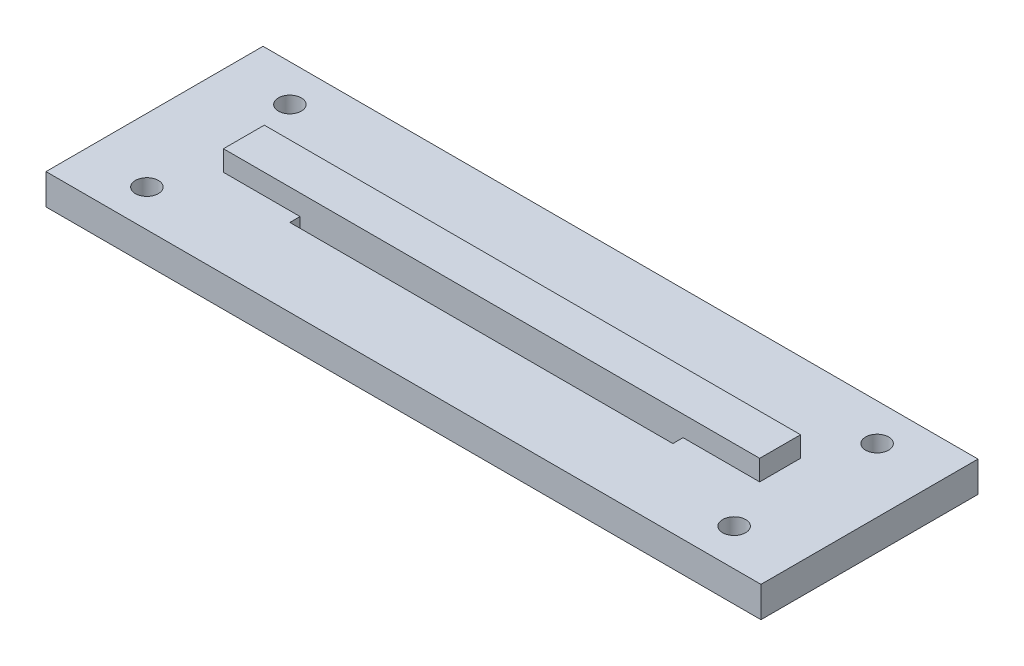
ISO-10303-21;
HEADER;
FILE_DESCRIPTION(('STEP AP214'),'2;1');
FILE_NAME('part.step','',(''),(''),'','','');
FILE_SCHEMA(('AUTOMOTIVE_DESIGN { 1 0 10303 214 1 1 1 1 }'));
ENDSEC;
DATA;
#1=APPLICATION_CONTEXT('core data for automotive mechanical design processes');
#2=APPLICATION_PROTOCOL_DEFINITION('international standard','automotive_design',2000,#1);
#3=PRODUCT_CONTEXT('',#1,'mechanical');
#4=PRODUCT('Part','Part','',(#3));
#5=PRODUCT_RELATED_PRODUCT_CATEGORY('part','',(#4));
#6=PRODUCT_DEFINITION_FORMATION('','',#4);
#7=PRODUCT_DEFINITION_CONTEXT('part definition',#1,'design');
#8=PRODUCT_DEFINITION('design','',#6,#7);
#9=PRODUCT_DEFINITION_SHAPE('','',#8);
#10=(LENGTH_UNIT() NAMED_UNIT(*) SI_UNIT(.MILLI.,.METRE.));
#11=(NAMED_UNIT(*) PLANE_ANGLE_UNIT() SI_UNIT($,.RADIAN.));
#12=(NAMED_UNIT(*) SI_UNIT($,.STERADIAN.) SOLID_ANGLE_UNIT());
#13=UNCERTAINTY_MEASURE_WITH_UNIT(LENGTH_MEASURE(1.E-05),#10,'distance_accuracy_value','');
#14=(GEOMETRIC_REPRESENTATION_CONTEXT(3) GLOBAL_UNCERTAINTY_ASSIGNED_CONTEXT((#13)) GLOBAL_UNIT_ASSIGNED_CONTEXT((#10,
#11,#12)) REPRESENTATION_CONTEXT('',''));
#15=CARTESIAN_POINT('',(0.,0.,0.));
#16=DIRECTION('',(0.,0.,1.));
#17=DIRECTION('',(1.,0.,0.));
#18=AXIS2_PLACEMENT_3D('',#15,#16,#17);
#19=CARTESIAN_POINT('',(0.,12.,0.));
#20=DIRECTION('',(0.,-1.,0.));
#21=DIRECTION('',(0.,0.,-1.));
#22=AXIS2_PLACEMENT_3D('',#19,#20,#21);
#23=PLANE('',#22);
#24=CARTESIAN_POINT('',(115.,12.,-28.));
#25=DIRECTION('',(0.,1.,0.));
#26=DIRECTION('',(0.,0.,1.));
#27=AXIS2_PLACEMENT_3D('',#24,#25,#26);
#28=CIRCLE('',#27,4.5);
#29=CARTESIAN_POINT('',(115.,12.,-23.5));
#30=VERTEX_POINT('',#29);
#31=EDGE_CURVE('E232',#30,#30,#28,.T.);
#32=ORIENTED_EDGE('',*,*,#31,.F.);
#33=EDGE_LOOP('',(#32));
#34=FACE_BOUND('',#33,.T.);
#35=CARTESIAN_POINT('',(-115.,12.,-28.));
#36=DIRECTION('',(0.,1.,0.));
#37=DIRECTION('',(0.,0.,1.));
#38=AXIS2_PLACEMENT_3D('',#35,#36,#37);
#39=CIRCLE('',#38,4.5);
#40=CARTESIAN_POINT('',(-115.,12.,-23.5));
#41=VERTEX_POINT('',#40);
#42=EDGE_CURVE('E238',#41,#41,#39,.T.);
#43=ORIENTED_EDGE('',*,*,#42,.F.);
#44=EDGE_LOOP('',(#43));
#45=FACE_BOUND('',#44,.T.);
#46=CARTESIAN_POINT('',(115.,12.,28.));
#47=DIRECTION('',(0.,1.,0.));
#48=DIRECTION('',(0.,0.,1.));
#49=AXIS2_PLACEMENT_3D('',#46,#47,#48);
#50=CIRCLE('',#49,4.5);
#51=CARTESIAN_POINT('',(115.,12.,32.5));
#52=VERTEX_POINT('',#51);
#53=EDGE_CURVE('E244',#52,#52,#50,.T.);
#54=ORIENTED_EDGE('',*,*,#53,.F.);
#55=EDGE_LOOP('',(#54));
#56=FACE_BOUND('',#55,.T.);
#57=CARTESIAN_POINT('',(-115.,12.,28.));
#58=DIRECTION('',(0.,1.,0.));
#59=DIRECTION('',(0.,0.,1.));
#60=AXIS2_PLACEMENT_3D('',#57,#58,#59);
#61=CIRCLE('',#60,4.5);
#62=CARTESIAN_POINT('',(-115.,12.,32.5));
#63=VERTEX_POINT('',#62);
#64=EDGE_CURVE('E250',#63,#63,#61,.T.);
#65=ORIENTED_EDGE('',*,*,#64,.F.);
#66=EDGE_LOOP('',(#65));
#67=FACE_BOUND('',#66,.T.);
#68=DIRECTION('',(0.,0.,-1.));
#69=VECTOR('',#68,1.);
#70=CARTESIAN_POINT('',(140.,12.,42.5));
#71=LINE('',#70,#69);
#72=CARTESIAN_POINT('',(140.,12.,42.5));
#73=VERTEX_POINT('',#72);
#74=CARTESIAN_POINT('',(140.,12.,-42.5));
#75=VERTEX_POINT('',#74);
#76=EDGE_CURVE('E256',#73,#75,#71,.T.);
#77=ORIENTED_EDGE('',*,*,#76,.T.);
#78=DIRECTION('',(-1.,0.,0.));
#79=VECTOR('',#78,1.);
#80=CARTESIAN_POINT('',(-140.,12.,-42.5));
#81=LINE('',#80,#79);
#82=CARTESIAN_POINT('',(-140.,12.,-42.5));
#83=VERTEX_POINT('',#82);
#84=EDGE_CURVE('E259',#75,#83,#81,.T.);
#85=ORIENTED_EDGE('',*,*,#84,.T.);
#86=DIRECTION('',(0.,0.,1.));
#87=VECTOR('',#86,1.);
#88=CARTESIAN_POINT('',(-140.,12.,42.5));
#89=LINE('',#88,#87);
#90=CARTESIAN_POINT('',(-140.,12.,42.5));
#91=VERTEX_POINT('',#90);
#92=EDGE_CURVE('E262',#83,#91,#89,.T.);
#93=ORIENTED_EDGE('',*,*,#92,.T.);
#94=DIRECTION('',(1.,0.,0.));
#95=VECTOR('',#94,1.);
#96=CARTESIAN_POINT('',(-140.,12.,42.5));
#97=LINE('',#96,#95);
#98=EDGE_CURVE('E264',#91,#73,#97,.T.);
#99=ORIENTED_EDGE('',*,*,#98,.T.);
#100=EDGE_LOOP('',(#77,#85,#93,#99));
#101=FACE_BOUND('',#100,.T.);
#102=DIRECTION('',(-1.,0.,0.));
#103=VECTOR('',#102,1.);
#104=CARTESIAN_POINT('',(0.,12.,-8.));
#105=LINE('',#104,#103);
#106=CARTESIAN_POINT('',(-75.,12.,-8.));
#107=VERTEX_POINT('',#106);
#108=CARTESIAN_POINT('',(-105.,12.,-8.));
#109=VERTEX_POINT('',#108);
#110=EDGE_CURVE('E187',#107,#109,#105,.T.);
#111=ORIENTED_EDGE('',*,*,#110,.F.);
#112=DIRECTION('',(0.,0.,1.));
#113=VECTOR('',#112,1.);
#114=CARTESIAN_POINT('',(-75.,12.,12.));
#115=LINE('',#114,#113);
#116=CARTESIAN_POINT('',(-75.,12.,-12.));
#117=VERTEX_POINT('',#116);
#118=EDGE_CURVE('E204',#117,#107,#115,.T.);
#119=ORIENTED_EDGE('',*,*,#118,.F.);
#120=DIRECTION('',(-1.,0.,0.));
#121=VECTOR('',#120,1.);
#122=CARTESIAN_POINT('',(-75.,12.,-12.));
#123=LINE('',#122,#121);
#124=CARTESIAN_POINT('',(75.,12.,-12.));
#125=VERTEX_POINT('',#124);
#126=EDGE_CURVE('E200',#125,#117,#123,.T.);
#127=ORIENTED_EDGE('',*,*,#126,.F.);
#128=DIRECTION('',(0.,0.,-1.));
#129=VECTOR('',#128,1.);
#130=CARTESIAN_POINT('',(75.,12.,12.));
#131=LINE('',#130,#129);
#132=CARTESIAN_POINT('',(75.,12.,-8.));
#133=VERTEX_POINT('',#132);
#134=EDGE_CURVE('E201',#133,#125,#131,.T.);
#135=ORIENTED_EDGE('',*,*,#134,.F.);
#136=CARTESIAN_POINT('',(105.,12.,-8.));
#137=VERTEX_POINT('',#136);
#138=EDGE_CURVE('E190',#137,#133,#105,.T.);
#139=ORIENTED_EDGE('',*,*,#138,.F.);
#140=DIRECTION('',(0.,0.,-1.));
#141=VECTOR('',#140,1.);
#142=CARTESIAN_POINT('',(105.,12.,0.));
#143=LINE('',#142,#141);
#144=CARTESIAN_POINT('',(105.,12.,8.));
#145=VERTEX_POINT('',#144);
#146=EDGE_CURVE('E175',#145,#137,#143,.T.);
#147=ORIENTED_EDGE('',*,*,#146,.F.);
#148=DIRECTION('',(1.,0.,0.));
#149=VECTOR('',#148,1.);
#150=CARTESIAN_POINT('',(0.,12.,8.));
#151=LINE('',#150,#149);
#152=CARTESIAN_POINT('',(75.,12.,8.));
#153=VERTEX_POINT('',#152);
#154=EDGE_CURVE('E180',#153,#145,#151,.T.);
#155=ORIENTED_EDGE('',*,*,#154,.F.);
#156=CARTESIAN_POINT('',(75.,12.,12.));
#157=VERTEX_POINT('',#156);
#158=EDGE_CURVE('E197',#157,#153,#131,.T.);
#159=ORIENTED_EDGE('',*,*,#158,.F.);
#160=DIRECTION('',(1.,0.,0.));
#161=VECTOR('',#160,1.);
#162=CARTESIAN_POINT('',(-75.,12.,12.));
#163=LINE('',#162,#161);
#164=CARTESIAN_POINT('',(-75.,12.,12.));
#165=VERTEX_POINT('',#164);
#166=EDGE_CURVE('E207',#165,#157,#163,.T.);
#167=ORIENTED_EDGE('',*,*,#166,.F.);
#168=CARTESIAN_POINT('',(-75.,12.,8.));
#169=VERTEX_POINT('',#168);
#170=EDGE_CURVE('E203',#169,#165,#115,.T.);
#171=ORIENTED_EDGE('',*,*,#170,.F.);
#172=CARTESIAN_POINT('',(-105.,12.,8.));
#173=VERTEX_POINT('',#172);
#174=EDGE_CURVE('E176',#173,#169,#151,.T.);
#175=ORIENTED_EDGE('',*,*,#174,.F.);
#176=DIRECTION('',(0.,0.,1.));
#177=VECTOR('',#176,1.);
#178=CARTESIAN_POINT('',(-105.,12.,0.));
#179=LINE('',#178,#177);
#180=EDGE_CURVE('E193',#109,#173,#179,.T.);
#181=ORIENTED_EDGE('',*,*,#180,.F.);
#182=EDGE_LOOP('',(#111,#119,#127,#135,#139,#147,#155,#159,#167,#171,#175,#181));
#183=FACE_BOUND('',#182,.T.);
#184=ADVANCED_FACE('F39',(#34,#45,#56,#67,#101,#183),#23,.F.);
#185=CARTESIAN_POINT('',(75.,12.,12.));
#186=DIRECTION('',(-1.,0.,0.));
#187=DIRECTION('',(0.,0.,1.));
#188=AXIS2_PLACEMENT_3D('',#185,#186,#187);
#189=PLANE('',#188);
#190=DIRECTION('',(0.,0.,-1.));
#191=VECTOR('',#190,1.);
#192=CARTESIAN_POINT('',(75.,0.,12.));
#193=LINE('',#192,#191);
#194=CARTESIAN_POINT('',(75.,0.,-8.));
#195=VERTEX_POINT('',#194);
#196=CARTESIAN_POINT('',(75.,0.,-12.));
#197=VERTEX_POINT('',#196);
#198=EDGE_CURVE('E196',#195,#197,#193,.T.);
#199=ORIENTED_EDGE('',*,*,#198,.F.);
#200=DIRECTION('',(0.,1.,0.));
#201=VECTOR('',#200,1.);
#202=CARTESIAN_POINT('',(75.,12.,-8.));
#203=LINE('',#202,#201);
#204=EDGE_CURVE('E189',#195,#133,#203,.T.);
#205=ORIENTED_EDGE('',*,*,#204,.T.);
#206=ORIENTED_EDGE('',*,*,#134,.T.);
#207=DIRECTION('',(0.,-1.,0.));
#208=VECTOR('',#207,1.);
#209=CARTESIAN_POINT('',(75.,12.,-12.));
#210=LINE('',#209,#208);
#211=EDGE_CURVE('E228',#125,#197,#210,.T.);
#212=ORIENTED_EDGE('',*,*,#211,.T.);
#213=EDGE_LOOP('',(#199,#205,#206,#212));
#214=FACE_BOUND('',#213,.T.);
#215=ADVANCED_FACE('F336',(#214),#189,.T.);
#216=ORIENTED_EDGE('',*,*,#158,.T.);
#217=DIRECTION('',(0.,-1.,0.));
#218=VECTOR('',#217,1.);
#219=CARTESIAN_POINT('',(75.,12.,8.));
#220=LINE('',#219,#218);
#221=CARTESIAN_POINT('',(75.,0.,8.));
#222=VERTEX_POINT('',#221);
#223=EDGE_CURVE('E178',#153,#222,#220,.T.);
#224=ORIENTED_EDGE('',*,*,#223,.T.);
#225=CARTESIAN_POINT('',(75.,0.,12.));
#226=VERTEX_POINT('',#225);
#227=EDGE_CURVE('E210',#226,#222,#193,.T.);
#228=ORIENTED_EDGE('',*,*,#227,.F.);
#229=DIRECTION('',(0.,-1.,0.));
#230=VECTOR('',#229,1.);
#231=CARTESIAN_POINT('',(75.,12.,12.));
#232=LINE('',#231,#230);
#233=EDGE_CURVE('E209',#157,#226,#232,.T.);
#234=ORIENTED_EDGE('',*,*,#233,.F.);
#235=EDGE_LOOP('',(#216,#224,#228,#234));
#236=FACE_BOUND('',#235,.T.);
#237=ADVANCED_FACE('F303',(#236),#189,.T.);
#238=CARTESIAN_POINT('',(-75.,12.,12.));
#239=DIRECTION('',(1.,0.,0.));
#240=DIRECTION('',(0.,0.,-1.));
#241=AXIS2_PLACEMENT_3D('',#238,#239,#240);
#242=PLANE('',#241);
#243=ORIENTED_EDGE('',*,*,#118,.T.);
#244=DIRECTION('',(0.,-1.,0.));
#245=VECTOR('',#244,1.);
#246=CARTESIAN_POINT('',(-75.,12.,-8.));
#247=LINE('',#246,#245);
#248=CARTESIAN_POINT('',(-75.,0.,-8.));
#249=VERTEX_POINT('',#248);
#250=EDGE_CURVE('E11',#107,#249,#247,.T.);
#251=ORIENTED_EDGE('',*,*,#250,.T.);
#252=DIRECTION('',(0.,0.,1.));
#253=VECTOR('',#252,1.);
#254=CARTESIAN_POINT('',(-75.,0.,12.));
#255=LINE('',#254,#253);
#256=CARTESIAN_POINT('',(-75.,0.,-12.));
#257=VERTEX_POINT('',#256);
#258=EDGE_CURVE('E216',#257,#249,#255,.T.);
#259=ORIENTED_EDGE('',*,*,#258,.F.);
#260=DIRECTION('',(0.,-1.,0.));
#261=VECTOR('',#260,1.);
#262=CARTESIAN_POINT('',(-75.,12.,-12.));
#263=LINE('',#262,#261);
#264=EDGE_CURVE('E226',#117,#257,#263,.T.);
#265=ORIENTED_EDGE('',*,*,#264,.F.);
#266=EDGE_LOOP('',(#243,#251,#259,#265));
#267=FACE_BOUND('',#266,.T.);
#268=ADVANCED_FACE('F385',(#267),#242,.T.);
#269=CARTESIAN_POINT('',(-75.,0.,8.));
#270=VERTEX_POINT('',#269);
#271=CARTESIAN_POINT('',(-75.,0.,12.));
#272=VERTEX_POINT('',#271);
#273=EDGE_CURVE('E215',#270,#272,#255,.T.);
#274=ORIENTED_EDGE('',*,*,#273,.F.);
#275=DIRECTION('',(0.,1.,0.));
#276=VECTOR('',#275,1.);
#277=CARTESIAN_POINT('',(-75.,12.,8.));
#278=LINE('',#277,#276);
#279=EDGE_CURVE('E47',#270,#169,#278,.T.);
#280=ORIENTED_EDGE('',*,*,#279,.T.);
#281=ORIENTED_EDGE('',*,*,#170,.T.);
#282=DIRECTION('',(0.,-1.,0.));
#283=VECTOR('',#282,1.);
#284=CARTESIAN_POINT('',(-75.,12.,12.));
#285=LINE('',#284,#283);
#286=EDGE_CURVE('E223',#165,#272,#285,.T.);
#287=ORIENTED_EDGE('',*,*,#286,.T.);
#288=EDGE_LOOP('',(#274,#280,#281,#287));
#289=FACE_BOUND('',#288,.T.);
#290=ADVANCED_FACE('F288',(#289),#242,.T.);
#291=CARTESIAN_POINT('',(0.,0.,0.));
#292=DIRECTION('',(0.,-1.,0.));
#293=DIRECTION('',(0.,0.,-1.));
#294=AXIS2_PLACEMENT_3D('',#291,#292,#293);
#295=PLANE('',#294);
#296=DIRECTION('',(-1.,0.,0.));
#297=VECTOR('',#296,1.);
#298=CARTESIAN_POINT('',(-105.,0.,-8.));
#299=LINE('',#298,#297);
#300=EDGE_CURVE('E54',#195,#249,#299,.T.);
#301=ORIENTED_EDGE('',*,*,#300,.F.);
#302=ORIENTED_EDGE('',*,*,#198,.T.);
#303=DIRECTION('',(-1.,0.,0.));
#304=VECTOR('',#303,1.);
#305=CARTESIAN_POINT('',(-75.,0.,-12.));
#306=LINE('',#305,#304);
#307=EDGE_CURVE('E212',#197,#257,#306,.T.);
#308=ORIENTED_EDGE('',*,*,#307,.T.);
#309=ORIENTED_EDGE('',*,*,#258,.T.);
#310=EDGE_LOOP('',(#301,#302,#308,#309));
#311=FACE_BOUND('',#310,.T.);
#312=DIRECTION('',(1.,0.,0.));
#313=VECTOR('',#312,1.);
#314=CARTESIAN_POINT('',(-105.,0.,8.));
#315=LINE('',#314,#313);
#316=EDGE_CURVE('E62',#270,#222,#315,.T.);
#317=ORIENTED_EDGE('',*,*,#316,.F.);
#318=ORIENTED_EDGE('',*,*,#273,.T.);
#319=DIRECTION('',(1.,0.,0.));
#320=VECTOR('',#319,1.);
#321=CARTESIAN_POINT('',(-75.,0.,12.));
#322=LINE('',#321,#320);
#323=EDGE_CURVE('E218',#272,#226,#322,.T.);
#324=ORIENTED_EDGE('',*,*,#323,.T.);
#325=ORIENTED_EDGE('',*,*,#227,.T.);
#326=EDGE_LOOP('',(#317,#318,#324,#325));
#327=FACE_BOUND('',#326,.T.);
#328=CARTESIAN_POINT('',(-115.,0.,-28.));
#329=DIRECTION('',(0.,1.,0.));
#330=DIRECTION('',(0.,0.,1.));
#331=AXIS2_PLACEMENT_3D('',#328,#329,#330);
#332=CIRCLE('',#331,4.5);
#333=CARTESIAN_POINT('',(-115.,0.,-23.5));
#334=VERTEX_POINT('',#333);
#335=EDGE_CURVE('E235',#334,#334,#332,.T.);
#336=ORIENTED_EDGE('',*,*,#335,.T.);
#337=EDGE_LOOP('',(#336));
#338=FACE_BOUND('',#337,.T.);
#339=CARTESIAN_POINT('',(-115.,0.,28.));
#340=DIRECTION('',(0.,1.,0.));
#341=DIRECTION('',(0.,0.,1.));
#342=AXIS2_PLACEMENT_3D('',#339,#340,#341);
#343=CIRCLE('',#342,4.5);
#344=CARTESIAN_POINT('',(-115.,0.,32.5));
#345=VERTEX_POINT('',#344);
#346=EDGE_CURVE('E247',#345,#345,#343,.T.);
#347=ORIENTED_EDGE('',*,*,#346,.T.);
#348=EDGE_LOOP('',(#347));
#349=FACE_BOUND('',#348,.T.);
#350=DIRECTION('',(0.,0.,-1.));
#351=VECTOR('',#350,1.);
#352=CARTESIAN_POINT('',(140.,0.,42.5));
#353=LINE('',#352,#351);
#354=CARTESIAN_POINT('',(140.,0.,42.5));
#355=VERTEX_POINT('',#354);
#356=CARTESIAN_POINT('',(140.,0.,-42.5));
#357=VERTEX_POINT('',#356);
#358=EDGE_CURVE('E253',#355,#357,#353,.T.);
#359=ORIENTED_EDGE('',*,*,#358,.F.);
#360=DIRECTION('',(1.,0.,0.));
#361=VECTOR('',#360,1.);
#362=CARTESIAN_POINT('',(-140.,0.,42.5));
#363=LINE('',#362,#361);
#364=CARTESIAN_POINT('',(-140.,0.,42.5));
#365=VERTEX_POINT('',#364);
#366=EDGE_CURVE('E260',#365,#355,#363,.T.);
#367=ORIENTED_EDGE('',*,*,#366,.F.);
#368=DIRECTION('',(0.,0.,1.));
#369=VECTOR('',#368,1.);
#370=CARTESIAN_POINT('',(-140.,0.,42.5));
#371=LINE('',#370,#369);
#372=CARTESIAN_POINT('',(-140.,0.,-42.5));
#373=VERTEX_POINT('',#372);
#374=EDGE_CURVE('E271',#373,#365,#371,.T.);
#375=ORIENTED_EDGE('',*,*,#374,.F.);
#376=DIRECTION('',(-1.,0.,0.));
#377=VECTOR('',#376,1.);
#378=CARTESIAN_POINT('',(-140.,0.,-42.5));
#379=LINE('',#378,#377);
#380=EDGE_CURVE('E269',#357,#373,#379,.T.);
#381=ORIENTED_EDGE('',*,*,#380,.F.);
#382=EDGE_LOOP('',(#359,#367,#375,#381));
#383=FACE_BOUND('',#382,.T.);
#384=CARTESIAN_POINT('',(115.,0.,28.));
#385=DIRECTION('',(0.,1.,0.));
#386=DIRECTION('',(0.,0.,1.));
#387=AXIS2_PLACEMENT_3D('',#384,#385,#386);
#388=CIRCLE('',#387,4.5);
#389=CARTESIAN_POINT('',(115.,0.,32.5));
#390=VERTEX_POINT('',#389);
#391=EDGE_CURVE('E241',#390,#390,#388,.T.);
#392=ORIENTED_EDGE('',*,*,#391,.T.);
#393=EDGE_LOOP('',(#392));
#394=FACE_BOUND('',#393,.T.);
#395=CARTESIAN_POINT('',(115.,0.,-28.));
#396=DIRECTION('',(0.,1.,0.));
#397=DIRECTION('',(0.,0.,1.));
#398=AXIS2_PLACEMENT_3D('',#395,#396,#397);
#399=CIRCLE('',#398,4.5);
#400=CARTESIAN_POINT('',(115.,0.,-23.5));
#401=VERTEX_POINT('',#400);
#402=EDGE_CURVE('E231',#401,#401,#399,.T.);
#403=ORIENTED_EDGE('',*,*,#402,.T.);
#404=EDGE_LOOP('',(#403));
#405=FACE_BOUND('',#404,.T.);
#406=ADVANCED_FACE('F304',(#311,#327,#338,#349,#383,#394,#405),#295,.T.);
#407=CARTESIAN_POINT('',(140.,12.,42.5));
#408=DIRECTION('',(-1.,0.,0.));
#409=DIRECTION('',(0.,0.,1.));
#410=AXIS2_PLACEMENT_3D('',#407,#408,#409);
#411=PLANE('',#410);
#412=ORIENTED_EDGE('',*,*,#358,.T.);
#413=DIRECTION('',(0.,-1.,0.));
#414=VECTOR('',#413,1.);
#415=CARTESIAN_POINT('',(140.,12.,-42.5));
#416=LINE('',#415,#414);
#417=EDGE_CURVE('E282',#75,#357,#416,.T.);
#418=ORIENTED_EDGE('',*,*,#417,.F.);
#419=ORIENTED_EDGE('',*,*,#76,.F.);
#420=DIRECTION('',(0.,-1.,0.));
#421=VECTOR('',#420,1.);
#422=CARTESIAN_POINT('',(140.,12.,42.5));
#423=LINE('',#422,#421);
#424=EDGE_CURVE('E266',#73,#355,#423,.T.);
#425=ORIENTED_EDGE('',*,*,#424,.T.);
#426=EDGE_LOOP('',(#412,#418,#419,#425));
#427=FACE_BOUND('',#426,.T.);
#428=ADVANCED_FACE('F41',(#427),#411,.F.);
#429=CARTESIAN_POINT('',(-140.,12.,-42.5));
#430=DIRECTION('',(0.,0.,1.));
#431=DIRECTION('',(1.,0.,0.));
#432=AXIS2_PLACEMENT_3D('',#429,#430,#431);
#433=PLANE('',#432);
#434=ORIENTED_EDGE('',*,*,#380,.T.);
#435=DIRECTION('',(0.,-1.,0.));
#436=VECTOR('',#435,1.);
#437=CARTESIAN_POINT('',(-140.,12.,-42.5));
#438=LINE('',#437,#436);
#439=EDGE_CURVE('E279',#83,#373,#438,.T.);
#440=ORIENTED_EDGE('',*,*,#439,.F.);
#441=ORIENTED_EDGE('',*,*,#84,.F.);
#442=ORIENTED_EDGE('',*,*,#417,.T.);
#443=EDGE_LOOP('',(#434,#440,#441,#442));
#444=FACE_BOUND('',#443,.T.);
#445=ADVANCED_FACE('F355',(#444),#433,.F.);
#446=CARTESIAN_POINT('',(-140.,12.,42.5));
#447=DIRECTION('',(1.,0.,0.));
#448=DIRECTION('',(0.,0.,-1.));
#449=AXIS2_PLACEMENT_3D('',#446,#447,#448);
#450=PLANE('',#449);
#451=ORIENTED_EDGE('',*,*,#374,.T.);
#452=DIRECTION('',(0.,-1.,0.));
#453=VECTOR('',#452,1.);
#454=CARTESIAN_POINT('',(-140.,12.,42.5));
#455=LINE('',#454,#453);
#456=EDGE_CURVE('E276',#91,#365,#455,.T.);
#457=ORIENTED_EDGE('',*,*,#456,.F.);
#458=ORIENTED_EDGE('',*,*,#92,.F.);
#459=ORIENTED_EDGE('',*,*,#439,.T.);
#460=EDGE_LOOP('',(#451,#457,#458,#459));
#461=FACE_BOUND('',#460,.T.);
#462=ADVANCED_FACE('F352',(#461),#450,.F.);
#463=CARTESIAN_POINT('',(-140.,12.,42.5));
#464=DIRECTION('',(0.,0.,-1.));
#465=DIRECTION('',(-1.,0.,0.));
#466=AXIS2_PLACEMENT_3D('',#463,#464,#465);
#467=PLANE('',#466);
#468=ORIENTED_EDGE('',*,*,#366,.T.);
#469=ORIENTED_EDGE('',*,*,#424,.F.);
#470=ORIENTED_EDGE('',*,*,#98,.F.);
#471=ORIENTED_EDGE('',*,*,#456,.T.);
#472=EDGE_LOOP('',(#468,#469,#470,#471));
#473=FACE_BOUND('',#472,.T.);
#474=ADVANCED_FACE('F349',(#473),#467,.F.);
#475=CARTESIAN_POINT('',(-115.,12.,28.));
#476=DIRECTION('',(0.,-1.,0.));
#477=DIRECTION('',(0.,0.,-1.));
#478=AXIS2_PLACEMENT_3D('',#475,#476,#477);
#479=CYLINDRICAL_SURFACE('',#478,4.5);
#480=ORIENTED_EDGE('',*,*,#64,.T.);
#481=EDGE_LOOP('',(#480));
#482=FACE_BOUND('',#481,.T.);
#483=ORIENTED_EDGE('',*,*,#346,.F.);
#484=EDGE_LOOP('',(#483));
#485=FACE_BOUND('',#484,.T.);
#486=ADVANCED_FACE('F346',(#482,#485),#479,.F.);
#487=CARTESIAN_POINT('',(115.,12.,28.));
#488=DIRECTION('',(0.,-1.,0.));
#489=DIRECTION('',(0.,0.,-1.));
#490=AXIS2_PLACEMENT_3D('',#487,#488,#489);
#491=CYLINDRICAL_SURFACE('',#490,4.5);
#492=ORIENTED_EDGE('',*,*,#53,.T.);
#493=EDGE_LOOP('',(#492));
#494=FACE_BOUND('',#493,.T.);
#495=ORIENTED_EDGE('',*,*,#391,.F.);
#496=EDGE_LOOP('',(#495));
#497=FACE_BOUND('',#496,.T.);
#498=ADVANCED_FACE('F331',(#494,#497),#491,.F.);
#499=CARTESIAN_POINT('',(-115.,12.,-28.));
#500=DIRECTION('',(0.,-1.,0.));
#501=DIRECTION('',(0.,0.,-1.));
#502=AXIS2_PLACEMENT_3D('',#499,#500,#501);
#503=CYLINDRICAL_SURFACE('',#502,4.5);
#504=ORIENTED_EDGE('',*,*,#42,.T.);
#505=EDGE_LOOP('',(#504));
#506=FACE_BOUND('',#505,.T.);
#507=ORIENTED_EDGE('',*,*,#335,.F.);
#508=EDGE_LOOP('',(#507));
#509=FACE_BOUND('',#508,.T.);
#510=ADVANCED_FACE('F322',(#506,#509),#503,.F.);
#511=CARTESIAN_POINT('',(115.,12.,-28.));
#512=DIRECTION('',(0.,-1.,0.));
#513=DIRECTION('',(0.,0.,-1.));
#514=AXIS2_PLACEMENT_3D('',#511,#512,#513);
#515=CYLINDRICAL_SURFACE('',#514,4.5);
#516=ORIENTED_EDGE('',*,*,#31,.T.);
#517=EDGE_LOOP('',(#516));
#518=FACE_BOUND('',#517,.T.);
#519=ORIENTED_EDGE('',*,*,#402,.F.);
#520=EDGE_LOOP('',(#519));
#521=FACE_BOUND('',#520,.T.);
#522=ADVANCED_FACE('F319',(#518,#521),#515,.F.);
#523=CARTESIAN_POINT('',(-75.,12.,-12.));
#524=DIRECTION('',(0.,0.,1.));
#525=DIRECTION('',(1.,0.,0.));
#526=AXIS2_PLACEMENT_3D('',#523,#524,#525);
#527=PLANE('',#526);
#528=ORIENTED_EDGE('',*,*,#307,.F.);
#529=ORIENTED_EDGE('',*,*,#211,.F.);
#530=ORIENTED_EDGE('',*,*,#126,.T.);
#531=ORIENTED_EDGE('',*,*,#264,.T.);
#532=EDGE_LOOP('',(#528,#529,#530,#531));
#533=FACE_BOUND('',#532,.T.);
#534=ADVANCED_FACE('F321',(#533),#527,.T.);
#535=CARTESIAN_POINT('',(-75.,12.,12.));
#536=DIRECTION('',(0.,0.,-1.));
#537=DIRECTION('',(-1.,0.,0.));
#538=AXIS2_PLACEMENT_3D('',#535,#536,#537);
#539=PLANE('',#538);
#540=ORIENTED_EDGE('',*,*,#323,.F.);
#541=ORIENTED_EDGE('',*,*,#286,.F.);
#542=ORIENTED_EDGE('',*,*,#166,.T.);
#543=ORIENTED_EDGE('',*,*,#233,.T.);
#544=EDGE_LOOP('',(#540,#541,#542,#543));
#545=FACE_BOUND('',#544,.T.);
#546=ADVANCED_FACE('F301',(#545),#539,.T.);
#547=CARTESIAN_POINT('',(105.,20.,8.));
#548=DIRECTION('',(-1.,0.,0.));
#549=DIRECTION('',(0.,0.,1.));
#550=AXIS2_PLACEMENT_3D('',#547,#548,#549);
#551=PLANE('',#550);
#552=DIRECTION('',(0.,-1.,0.));
#553=VECTOR('',#552,1.);
#554=CARTESIAN_POINT('',(105.,20.,8.));
#555=LINE('',#554,#553);
#556=CARTESIAN_POINT('',(105.,20.,8.));
#557=VERTEX_POINT('',#556);
#558=EDGE_CURVE('E550',#557,#145,#555,.T.);
#559=ORIENTED_EDGE('',*,*,#558,.T.);
#560=ORIENTED_EDGE('',*,*,#146,.T.);
#561=DIRECTION('',(0.,-1.,0.));
#562=VECTOR('',#561,1.);
#563=CARTESIAN_POINT('',(105.,20.,-8.));
#564=LINE('',#563,#562);
#565=CARTESIAN_POINT('',(105.,20.,-8.));
#566=VERTEX_POINT('',#565);
#567=EDGE_CURVE('E156',#566,#137,#564,.T.);
#568=ORIENTED_EDGE('',*,*,#567,.F.);
#569=DIRECTION('',(0.,0.,-1.));
#570=VECTOR('',#569,1.);
#571=CARTESIAN_POINT('',(105.,20.,8.));
#572=LINE('',#571,#570);
#573=EDGE_CURVE('E163',#557,#566,#572,.T.);
#574=ORIENTED_EDGE('',*,*,#573,.F.);
#575=EDGE_LOOP('',(#559,#560,#568,#574));
#576=FACE_BOUND('',#575,.T.);
#577=ADVANCED_FACE('F173',(#576),#551,.F.);
#578=CARTESIAN_POINT('',(-105.,20.,8.));
#579=DIRECTION('',(1.,0.,0.));
#580=DIRECTION('',(0.,0.,-1.));
#581=AXIS2_PLACEMENT_3D('',#578,#579,#580);
#582=PLANE('',#581);
#583=DIRECTION('',(0.,-1.,0.));
#584=VECTOR('',#583,1.);
#585=CARTESIAN_POINT('',(-105.,20.,-8.));
#586=LINE('',#585,#584);
#587=CARTESIAN_POINT('',(-105.,20.,-8.));
#588=VERTEX_POINT('',#587);
#589=EDGE_CURVE('E159',#588,#109,#586,.T.);
#590=ORIENTED_EDGE('',*,*,#589,.T.);
#591=ORIENTED_EDGE('',*,*,#180,.T.);
#592=DIRECTION('',(0.,-1.,0.));
#593=VECTOR('',#592,1.);
#594=CARTESIAN_POINT('',(-105.,20.,8.));
#595=LINE('',#594,#593);
#596=CARTESIAN_POINT('',(-105.,20.,8.));
#597=VERTEX_POINT('',#596);
#598=EDGE_CURVE('E181',#597,#173,#595,.T.);
#599=ORIENTED_EDGE('',*,*,#598,.F.);
#600=DIRECTION('',(0.,0.,1.));
#601=VECTOR('',#600,1.);
#602=CARTESIAN_POINT('',(-105.,20.,8.));
#603=LINE('',#602,#601);
#604=EDGE_CURVE('E162',#588,#597,#603,.T.);
#605=ORIENTED_EDGE('',*,*,#604,.F.);
#606=EDGE_LOOP('',(#590,#591,#599,#605));
#607=FACE_BOUND('',#606,.T.);
#608=ADVANCED_FACE('F494',(#607),#582,.F.);
#609=CARTESIAN_POINT('',(-105.,20.,-8.));
#610=DIRECTION('',(0.,0.,1.));
#611=DIRECTION('',(1.,0.,0.));
#612=AXIS2_PLACEMENT_3D('',#609,#610,#611);
#613=PLANE('',#612);
#614=ORIENTED_EDGE('',*,*,#567,.T.);
#615=ORIENTED_EDGE('',*,*,#138,.T.);
#616=ORIENTED_EDGE('',*,*,#204,.F.);
#617=ORIENTED_EDGE('',*,*,#300,.T.);
#618=ORIENTED_EDGE('',*,*,#250,.F.);
#619=ORIENTED_EDGE('',*,*,#110,.T.);
#620=ORIENTED_EDGE('',*,*,#589,.F.);
#621=DIRECTION('',(-1.,0.,0.));
#622=VECTOR('',#621,1.);
#623=CARTESIAN_POINT('',(-105.,20.,-8.));
#624=LINE('',#623,#622);
#625=EDGE_CURVE('E152',#566,#588,#624,.T.);
#626=ORIENTED_EDGE('',*,*,#625,.F.);
#627=EDGE_LOOP('',(#614,#615,#616,#617,#618,#619,#620,#626));
#628=FACE_BOUND('',#627,.T.);
#629=ADVANCED_FACE('F154',(#628),#613,.F.);
#630=CARTESIAN_POINT('',(-105.,20.,8.));
#631=DIRECTION('',(0.,0.,-1.));
#632=DIRECTION('',(-1.,0.,0.));
#633=AXIS2_PLACEMENT_3D('',#630,#631,#632);
#634=PLANE('',#633);
#635=ORIENTED_EDGE('',*,*,#223,.F.);
#636=ORIENTED_EDGE('',*,*,#154,.T.);
#637=ORIENTED_EDGE('',*,*,#558,.F.);
#638=DIRECTION('',(1.,0.,0.));
#639=VECTOR('',#638,1.);
#640=CARTESIAN_POINT('',(-105.,20.,8.));
#641=LINE('',#640,#639);
#642=EDGE_CURVE('E168',#597,#557,#641,.T.);
#643=ORIENTED_EDGE('',*,*,#642,.F.);
#644=ORIENTED_EDGE('',*,*,#598,.T.);
#645=ORIENTED_EDGE('',*,*,#174,.T.);
#646=ORIENTED_EDGE('',*,*,#279,.F.);
#647=ORIENTED_EDGE('',*,*,#316,.T.);
#648=EDGE_LOOP('',(#635,#636,#637,#643,#644,#645,#646,#647));
#649=FACE_BOUND('',#648,.T.);
#650=ADVANCED_FACE('F514',(#649),#634,.F.);
#651=CARTESIAN_POINT('',(0.,20.,0.));
#652=DIRECTION('',(0.,-1.,0.));
#653=DIRECTION('',(0.,0.,-1.));
#654=AXIS2_PLACEMENT_3D('',#651,#652,#653);
#655=PLANE('',#654);
#656=ORIENTED_EDGE('',*,*,#573,.T.);
#657=ORIENTED_EDGE('',*,*,#625,.T.);
#658=ORIENTED_EDGE('',*,*,#604,.T.);
#659=ORIENTED_EDGE('',*,*,#642,.T.);
#660=EDGE_LOOP('',(#656,#657,#658,#659));
#661=FACE_BOUND('',#660,.T.);
#662=ADVANCED_FACE('F166',(#661),#655,.F.);
#663=CLOSED_SHELL('',(#184,#215,#237,#268,#290,#406,#428,#445,#462,#474,#486,#498,#510,#522,
#534,#546,#577,#608,#629,#650,#662));
#664=MANIFOLD_SOLID_BREP('B2',#663);
#665=ADVANCED_BREP_SHAPE_REPRESENTATION('',(#18,#664),#14);
#666=SHAPE_DEFINITION_REPRESENTATION(#9,#665);
ENDSEC;
END-ISO-10303-21;
